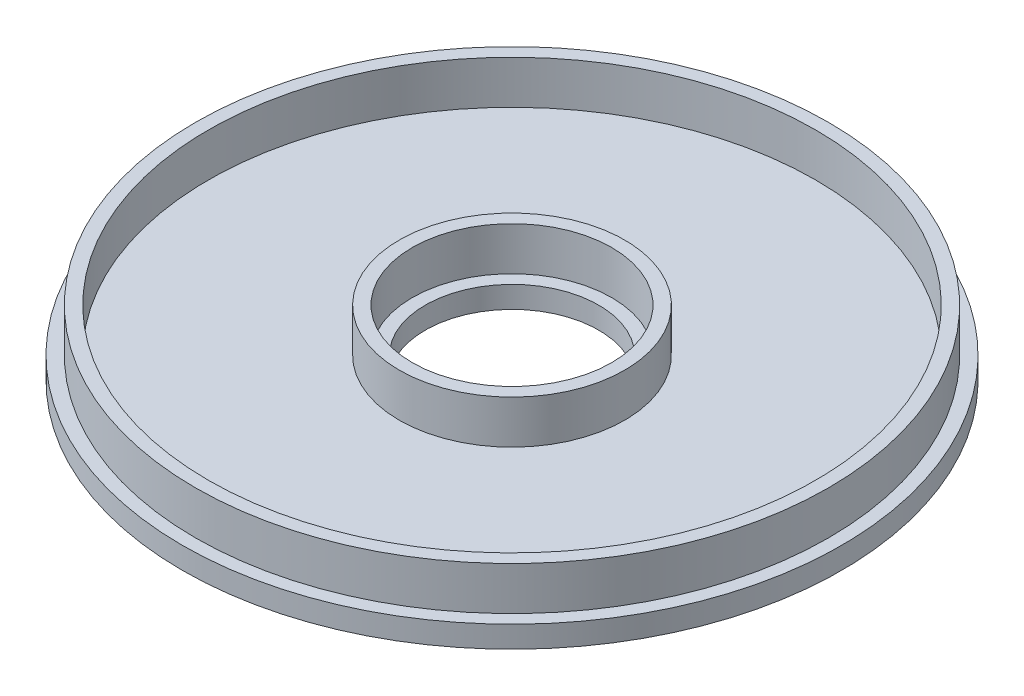
ISO-10303-21;
HEADER;
FILE_DESCRIPTION(('STEP AP214'),'2;1');
FILE_NAME('part.step','',(''),(''),'','','');
FILE_SCHEMA(('AUTOMOTIVE_DESIGN { 1 0 10303 214 1 1 1 1 }'));
ENDSEC;
DATA;
#1=APPLICATION_CONTEXT('core data for automotive mechanical design processes');
#2=APPLICATION_PROTOCOL_DEFINITION('international standard','automotive_design',2000,#1);
#3=PRODUCT_CONTEXT('',#1,'mechanical');
#4=PRODUCT('Part','Part','',(#3));
#5=PRODUCT_RELATED_PRODUCT_CATEGORY('part','',(#4));
#6=PRODUCT_DEFINITION_FORMATION('','',#4);
#7=PRODUCT_DEFINITION_CONTEXT('part definition',#1,'design');
#8=PRODUCT_DEFINITION('design','',#6,#7);
#9=PRODUCT_DEFINITION_SHAPE('','',#8);
#10=(LENGTH_UNIT() NAMED_UNIT(*) SI_UNIT(.MILLI.,.METRE.));
#11=(NAMED_UNIT(*) PLANE_ANGLE_UNIT() SI_UNIT($,.RADIAN.));
#12=(NAMED_UNIT(*) SI_UNIT($,.STERADIAN.) SOLID_ANGLE_UNIT());
#13=UNCERTAINTY_MEASURE_WITH_UNIT(LENGTH_MEASURE(1.E-05),#10,'distance_accuracy_value','');
#14=(GEOMETRIC_REPRESENTATION_CONTEXT(3) GLOBAL_UNCERTAINTY_ASSIGNED_CONTEXT((#13)) GLOBAL_UNIT_ASSIGNED_CONTEXT((#10,
#11,#12)) REPRESENTATION_CONTEXT('',''));
#15=CARTESIAN_POINT('',(0.,0.,0.));
#16=DIRECTION('',(0.,0.,1.));
#17=DIRECTION('',(1.,0.,0.));
#18=AXIS2_PLACEMENT_3D('',#15,#16,#17);
#19=CARTESIAN_POINT('',(0.,5.,0.));
#20=DIRECTION('',(0.,1.,0.));
#21=DIRECTION('',(0.,0.,1.));
#22=AXIS2_PLACEMENT_3D('',#19,#20,#21);
#23=PLANE('',#22);
#24=CARTESIAN_POINT('',(0.,5.,0.));
#25=DIRECTION('',(0.,1.,0.));
#26=DIRECTION('',(0.,0.,1.));
#27=AXIS2_PLACEMENT_3D('',#24,#25,#26);
#28=CIRCLE('',#27,20.);
#29=CARTESIAN_POINT('',(0.,5.,20.));
#30=VERTEX_POINT('',#29);
#31=EDGE_CURVE('E58',#30,#30,#28,.T.);
#32=ORIENTED_EDGE('',*,*,#31,.F.);
#33=EDGE_LOOP('',(#32));
#34=FACE_BOUND('',#33,.T.);
#35=CARTESIAN_POINT('',(0.,5.,0.));
#36=DIRECTION('',(0.,1.,0.));
#37=DIRECTION('',(0.,0.,1.));
#38=AXIS2_PLACEMENT_3D('',#35,#36,#37);
#39=CIRCLE('',#38,23.);
#40=CARTESIAN_POINT('',(0.,5.,23.));
#41=VERTEX_POINT('',#40);
#42=EDGE_CURVE('E11',#41,#41,#39,.F.);
#43=ORIENTED_EDGE('',*,*,#42,.F.);
#44=EDGE_LOOP('',(#43));
#45=FACE_BOUND('',#44,.T.);
#46=ADVANCED_FACE('F39',(#34,#45),#23,.T.);
#47=CARTESIAN_POINT('',(0.,5.,0.));
#48=DIRECTION('',(0.,1.,0.));
#49=DIRECTION('',(0.,0.,1.));
#50=AXIS2_PLACEMENT_3D('',#47,#48,#49);
#51=CIRCLE('',#50,26.);
#52=CARTESIAN_POINT('',(0.,5.,26.));
#53=VERTEX_POINT('',#52);
#54=EDGE_CURVE('E75',#53,#53,#51,.T.);
#55=ORIENTED_EDGE('',*,*,#54,.F.);
#56=EDGE_LOOP('',(#55));
#57=FACE_BOUND('',#56,.T.);
#58=CARTESIAN_POINT('',(0.,5.,0.));
#59=DIRECTION('',(0.,1.,0.));
#60=DIRECTION('',(0.,0.,1.));
#61=AXIS2_PLACEMENT_3D('',#58,#59,#60);
#62=CIRCLE('',#61,70.);
#63=CARTESIAN_POINT('',(0.,5.,70.));
#64=VERTEX_POINT('',#63);
#65=EDGE_CURVE('E46',#64,#64,#62,.F.);
#66=ORIENTED_EDGE('',*,*,#65,.F.);
#67=EDGE_LOOP('',(#66));
#68=FACE_BOUND('',#67,.T.);
#69=ADVANCED_FACE('F98',(#57,#68),#23,.T.);
#70=CARTESIAN_POINT('',(0.,5.,0.));
#71=DIRECTION('',(0.,1.,0.));
#72=DIRECTION('',(0.,0.,1.));
#73=AXIS2_PLACEMENT_3D('',#70,#71,#72);
#74=CIRCLE('',#73,73.);
#75=CARTESIAN_POINT('',(0.,5.,73.));
#76=VERTEX_POINT('',#75);
#77=EDGE_CURVE('E66',#76,#76,#74,.T.);
#78=ORIENTED_EDGE('',*,*,#77,.F.);
#79=EDGE_LOOP('',(#78));
#80=FACE_BOUND('',#79,.T.);
#81=CARTESIAN_POINT('',(0.,5.,0.));
#82=DIRECTION('',(0.,1.,0.));
#83=DIRECTION('',(0.,0.,1.));
#84=AXIS2_PLACEMENT_3D('',#81,#82,#83);
#85=CIRCLE('',#84,76.);
#86=CARTESIAN_POINT('',(0.,5.,76.));
#87=VERTEX_POINT('',#86);
#88=EDGE_CURVE('E50',#87,#87,#85,.T.);
#89=ORIENTED_EDGE('',*,*,#88,.T.);
#90=EDGE_LOOP('',(#89));
#91=FACE_BOUND('',#90,.T.);
#92=ADVANCED_FACE('F101',(#80,#91),#23,.T.);
#93=CARTESIAN_POINT('',(0.,0.,0.));
#94=DIRECTION('',(0.,1.,0.));
#95=DIRECTION('',(0.,0.,1.));
#96=AXIS2_PLACEMENT_3D('',#93,#94,#95);
#97=PLANE('',#96);
#98=CARTESIAN_POINT('',(0.,0.,0.));
#99=DIRECTION('',(0.,1.,0.));
#100=DIRECTION('',(0.,0.,1.));
#101=AXIS2_PLACEMENT_3D('',#98,#99,#100);
#102=CIRCLE('',#101,76.);
#103=CARTESIAN_POINT('',(0.,0.,76.));
#104=VERTEX_POINT('',#103);
#105=EDGE_CURVE('E54',#104,#104,#102,.T.);
#106=ORIENTED_EDGE('',*,*,#105,.F.);
#107=EDGE_LOOP('',(#106));
#108=FACE_BOUND('',#107,.T.);
#109=CARTESIAN_POINT('',(0.,0.,0.));
#110=DIRECTION('',(0.,1.,0.));
#111=DIRECTION('',(0.,0.,1.));
#112=AXIS2_PLACEMENT_3D('',#109,#110,#111);
#113=CIRCLE('',#112,20.);
#114=CARTESIAN_POINT('',(0.,0.,20.));
#115=VERTEX_POINT('',#114);
#116=EDGE_CURVE('E60',#115,#115,#113,.T.);
#117=ORIENTED_EDGE('',*,*,#116,.T.);
#118=EDGE_LOOP('',(#117));
#119=FACE_BOUND('',#118,.T.);
#120=ADVANCED_FACE('F107',(#108,#119),#97,.F.);
#121=CARTESIAN_POINT('',(0.,5.,0.));
#122=DIRECTION('',(0.,-1.,0.));
#123=DIRECTION('',(0.,0.,-1.));
#124=AXIS2_PLACEMENT_3D('',#121,#122,#123);
#125=CYLINDRICAL_SURFACE('',#124,76.);
#126=ORIENTED_EDGE('',*,*,#88,.F.);
#127=EDGE_LOOP('',(#126));
#128=FACE_BOUND('',#127,.T.);
#129=ORIENTED_EDGE('',*,*,#105,.T.);
#130=EDGE_LOOP('',(#129));
#131=FACE_BOUND('',#130,.T.);
#132=ADVANCED_FACE('F41',(#128,#131),#125,.T.);
#133=CARTESIAN_POINT('',(0.,5.,0.));
#134=DIRECTION('',(0.,-1.,0.));
#135=DIRECTION('',(0.,0.,-1.));
#136=AXIS2_PLACEMENT_3D('',#133,#134,#135);
#137=CYLINDRICAL_SURFACE('',#136,20.);
#138=ORIENTED_EDGE('',*,*,#31,.T.);
#139=EDGE_LOOP('',(#138));
#140=FACE_BOUND('',#139,.T.);
#141=ORIENTED_EDGE('',*,*,#116,.F.);
#142=EDGE_LOOP('',(#141));
#143=FACE_BOUND('',#142,.T.);
#144=ADVANCED_FACE('F111',(#140,#143),#137,.F.);
#145=CARTESIAN_POINT('',(0.,15.,0.));
#146=DIRECTION('',(0.,-1.,0.));
#147=DIRECTION('',(0.,0.,-1.));
#148=AXIS2_PLACEMENT_3D('',#145,#146,#147);
#149=CYLINDRICAL_SURFACE('',#148,70.);
#150=CARTESIAN_POINT('',(0.,15.,0.));
#151=DIRECTION('',(0.,1.,0.));
#152=DIRECTION('',(0.,0.,1.));
#153=AXIS2_PLACEMENT_3D('',#150,#151,#152);
#154=CIRCLE('',#153,70.);
#155=CARTESIAN_POINT('',(0.,15.,70.));
#156=VERTEX_POINT('',#155);
#157=EDGE_CURVE('E69',#156,#156,#154,.T.);
#158=ORIENTED_EDGE('',*,*,#157,.T.);
#159=EDGE_LOOP('',(#158));
#160=FACE_BOUND('',#159,.T.);
#161=ORIENTED_EDGE('',*,*,#65,.T.);
#162=EDGE_LOOP('',(#161));
#163=FACE_BOUND('',#162,.T.);
#164=ADVANCED_FACE('F124',(#160,#163),#149,.F.);
#165=CARTESIAN_POINT('',(0.,15.,0.));
#166=DIRECTION('',(0.,-1.,0.));
#167=DIRECTION('',(0.,0.,-1.));
#168=AXIS2_PLACEMENT_3D('',#165,#166,#167);
#169=CYLINDRICAL_SURFACE('',#168,73.);
#170=CARTESIAN_POINT('',(0.,15.,0.));
#171=DIRECTION('',(0.,1.,0.));
#172=DIRECTION('',(0.,0.,1.));
#173=AXIS2_PLACEMENT_3D('',#170,#171,#172);
#174=CIRCLE('',#173,73.);
#175=CARTESIAN_POINT('',(0.,15.,73.));
#176=VERTEX_POINT('',#175);
#177=EDGE_CURVE('E63',#176,#176,#174,.T.);
#178=ORIENTED_EDGE('',*,*,#177,.F.);
#179=EDGE_LOOP('',(#178));
#180=FACE_BOUND('',#179,.T.);
#181=ORIENTED_EDGE('',*,*,#77,.T.);
#182=EDGE_LOOP('',(#181));
#183=FACE_BOUND('',#182,.T.);
#184=ADVANCED_FACE('F129',(#180,#183),#169,.T.);
#185=CARTESIAN_POINT('',(0.,15.,0.));
#186=DIRECTION('',(0.,1.,0.));
#187=DIRECTION('',(0.,0.,1.));
#188=AXIS2_PLACEMENT_3D('',#185,#186,#187);
#189=PLANE('',#188);
#190=ORIENTED_EDGE('',*,*,#157,.F.);
#191=EDGE_LOOP('',(#190));
#192=FACE_BOUND('',#191,.T.);
#193=ORIENTED_EDGE('',*,*,#177,.T.);
#194=EDGE_LOOP('',(#193));
#195=FACE_BOUND('',#194,.T.);
#196=ADVANCED_FACE('F136',(#192,#195),#189,.T.);
#197=CARTESIAN_POINT('',(0.,15.,0.));
#198=DIRECTION('',(0.,-1.,0.));
#199=DIRECTION('',(0.,0.,-1.));
#200=AXIS2_PLACEMENT_3D('',#197,#198,#199);
#201=CYLINDRICAL_SURFACE('',#200,23.);
#202=CARTESIAN_POINT('',(0.,15.,0.));
#203=DIRECTION('',(0.,1.,0.));
#204=DIRECTION('',(0.,0.,1.));
#205=AXIS2_PLACEMENT_3D('',#202,#203,#204);
#206=CIRCLE('',#205,23.);
#207=CARTESIAN_POINT('',(0.,15.,23.));
#208=VERTEX_POINT('',#207);
#209=EDGE_CURVE('E78',#208,#208,#206,.T.);
#210=ORIENTED_EDGE('',*,*,#209,.T.);
#211=EDGE_LOOP('',(#210));
#212=FACE_BOUND('',#211,.T.);
#213=ORIENTED_EDGE('',*,*,#42,.T.);
#214=EDGE_LOOP('',(#213));
#215=FACE_BOUND('',#214,.T.);
#216=ADVANCED_FACE('F84',(#212,#215),#201,.F.);
#217=CARTESIAN_POINT('',(0.,15.,0.));
#218=DIRECTION('',(0.,-1.,0.));
#219=DIRECTION('',(0.,0.,-1.));
#220=AXIS2_PLACEMENT_3D('',#217,#218,#219);
#221=CYLINDRICAL_SURFACE('',#220,26.);
#222=CARTESIAN_POINT('',(0.,15.,0.));
#223=DIRECTION('',(0.,1.,0.));
#224=DIRECTION('',(0.,0.,1.));
#225=AXIS2_PLACEMENT_3D('',#222,#223,#224);
#226=CIRCLE('',#225,26.);
#227=CARTESIAN_POINT('',(0.,15.,26.));
#228=VERTEX_POINT('',#227);
#229=EDGE_CURVE('E70',#228,#228,#226,.T.);
#230=ORIENTED_EDGE('',*,*,#229,.F.);
#231=EDGE_LOOP('',(#230));
#232=FACE_BOUND('',#231,.T.);
#233=ORIENTED_EDGE('',*,*,#54,.T.);
#234=EDGE_LOOP('',(#233));
#235=FACE_BOUND('',#234,.T.);
#236=ADVANCED_FACE('F89',(#232,#235),#221,.T.);
#237=CARTESIAN_POINT('',(0.,15.,0.));
#238=DIRECTION('',(0.,1.,0.));
#239=DIRECTION('',(0.,0.,1.));
#240=AXIS2_PLACEMENT_3D('',#237,#238,#239);
#241=PLANE('',#240);
#242=ORIENTED_EDGE('',*,*,#209,.F.);
#243=EDGE_LOOP('',(#242));
#244=FACE_BOUND('',#243,.T.);
#245=ORIENTED_EDGE('',*,*,#229,.T.);
#246=EDGE_LOOP('',(#245));
#247=FACE_BOUND('',#246,.T.);
#248=ADVANCED_FACE('F86',(#244,#247),#241,.T.);
#249=CLOSED_SHELL('',(#46,#69,#92,#120,#132,#144,#164,#184,#196,#216,#236,#248));
#250=MANIFOLD_SOLID_BREP('B2',#249);
#251=ADVANCED_BREP_SHAPE_REPRESENTATION('',(#18,#250),#14);
#252=SHAPE_DEFINITION_REPRESENTATION(#9,#251);
ENDSEC;
END-ISO-10303-21;
